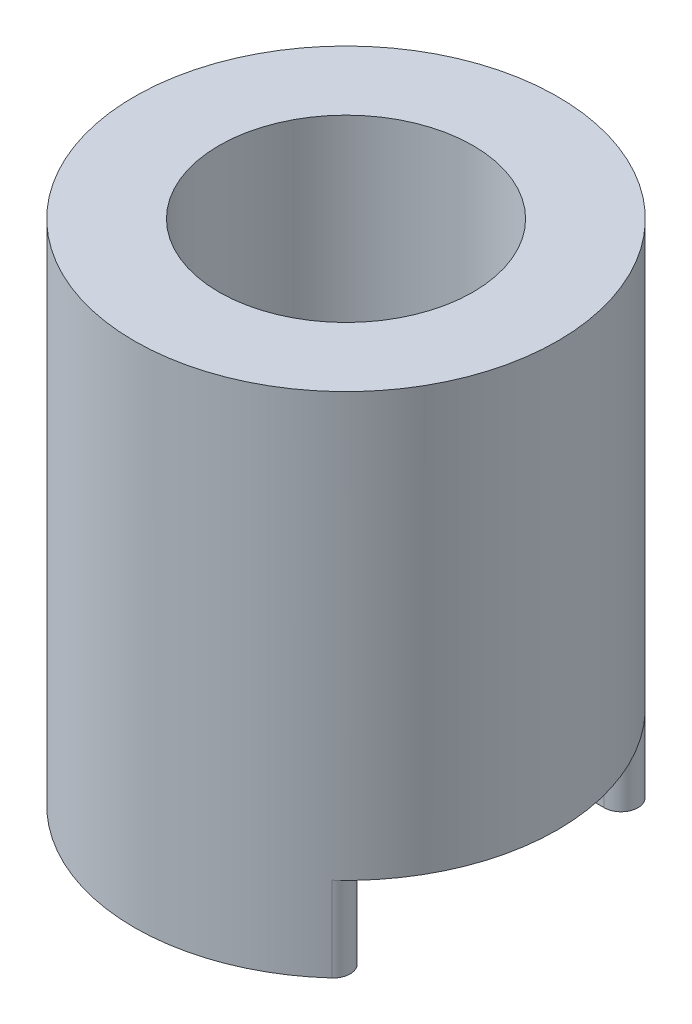
ISO-10303-21;
HEADER;
FILE_DESCRIPTION(('STEP AP214'),'2;1');
FILE_NAME('part.step','',(''),(''),'','','');
FILE_SCHEMA(('AUTOMOTIVE_DESIGN { 1 0 10303 214 1 1 1 1 }'));
ENDSEC;
DATA;
#1=APPLICATION_CONTEXT('core data for automotive mechanical design processes');
#2=APPLICATION_PROTOCOL_DEFINITION('international standard','automotive_design',2000,#1);
#3=PRODUCT_CONTEXT('',#1,'mechanical');
#4=PRODUCT('Part','Part','',(#3));
#5=PRODUCT_RELATED_PRODUCT_CATEGORY('part','',(#4));
#6=PRODUCT_DEFINITION_FORMATION('','',#4);
#7=PRODUCT_DEFINITION_CONTEXT('part definition',#1,'design');
#8=PRODUCT_DEFINITION('design','',#6,#7);
#9=PRODUCT_DEFINITION_SHAPE('','',#8);
#10=(LENGTH_UNIT() NAMED_UNIT(*) SI_UNIT(.MILLI.,.METRE.));
#11=(NAMED_UNIT(*) PLANE_ANGLE_UNIT() SI_UNIT($,.RADIAN.));
#12=(NAMED_UNIT(*) SI_UNIT($,.STERADIAN.) SOLID_ANGLE_UNIT());
#13=UNCERTAINTY_MEASURE_WITH_UNIT(LENGTH_MEASURE(1.E-05),#10,'distance_accuracy_value','');
#14=(GEOMETRIC_REPRESENTATION_CONTEXT(3) GLOBAL_UNCERTAINTY_ASSIGNED_CONTEXT((#13)) GLOBAL_UNIT_ASSIGNED_CONTEXT((#10,
#11,#12)) REPRESENTATION_CONTEXT('',''));
#15=CARTESIAN_POINT('',(0.,0.,0.));
#16=DIRECTION('',(0.,0.,1.));
#17=DIRECTION('',(1.,0.,0.));
#18=AXIS2_PLACEMENT_3D('',#15,#16,#17);
#19=CARTESIAN_POINT('',(-15.875,6.35,-9.525));
#20=DIRECTION('',(0.,1.,0.));
#21=DIRECTION('',(0.,0.,1.));
#22=AXIS2_PLACEMENT_3D('',#19,#20,#21);
#23=PLANE('',#22);
#24=DIRECTION('',(1.,0.,0.));
#25=VECTOR('',#24,1.);
#26=CARTESIAN_POINT('',(-15.875,6.35,9.525));
#27=LINE('',#26,#25);
#28=CARTESIAN_POINT('',(0.,6.35,9.525));
#29=VERTEX_POINT('',#28);
#30=CARTESIAN_POINT('',(9.83737769936684,6.35,9.525));
#31=VERTEX_POINT('',#30);
#32=EDGE_CURVE('E111',#29,#31,#27,.T.);
#33=ORIENTED_EDGE('',*,*,#32,.F.);
#34=CARTESIAN_POINT('',(0.,6.35,0.));
#35=DIRECTION('',(0.,1.,0.));
#36=DIRECTION('',(0.,0.,1.));
#37=AXIS2_PLACEMENT_3D('',#34,#35,#36);
#38=CIRCLE('',#37,9.525);
#39=CARTESIAN_POINT('',(0.,6.35,-9.525));
#40=VERTEX_POINT('',#39);
#41=EDGE_CURVE('E118',#29,#40,#38,.T.);
#42=ORIENTED_EDGE('',*,*,#41,.T.);
#43=DIRECTION('',(1.,0.,0.));
#44=VECTOR('',#43,1.);
#45=CARTESIAN_POINT('',(-15.875,6.35,-9.525));
#46=LINE('',#45,#44);
#47=CARTESIAN_POINT('',(9.83737769936684,6.35,-9.525));
#48=VERTEX_POINT('',#47);
#49=EDGE_CURVE('E112',#40,#48,#46,.T.);
#50=ORIENTED_EDGE('',*,*,#49,.T.);
#51=CARTESIAN_POINT('',(9.83737769936684,6.35,-10.795));
#52=DIRECTION('',(0.,1.,0.));
#53=DIRECTION('',(0.,0.,1.));
#54=AXIS2_PLACEMENT_3D('',#51,#52,#53);
#55=CIRCLE('',#54,1.27);
#56=CARTESIAN_POINT('',(10.6928018471379,6.35,-11.7336956521739));
#57=VERTEX_POINT('',#56);
#58=EDGE_CURVE('E43',#48,#57,#55,.T.);
#59=ORIENTED_EDGE('',*,*,#58,.T.);
#60=CARTESIAN_POINT('',(0.,6.35,0.));
#61=DIRECTION('',(0.,1.,0.));
#62=DIRECTION('',(0.,0.,1.));
#63=AXIS2_PLACEMENT_3D('',#60,#61,#62);
#64=CIRCLE('',#63,15.875);
#65=CARTESIAN_POINT('',(10.6928018471379,6.35,11.7336956521739));
#66=VERTEX_POINT('',#65);
#67=EDGE_CURVE('E142',#66,#57,#64,.T.);
#68=ORIENTED_EDGE('',*,*,#67,.F.);
#69=CARTESIAN_POINT('',(9.83737769936684,6.35,10.795));
#70=DIRECTION('',(0.,1.,0.));
#71=DIRECTION('',(0.,0.,1.));
#72=AXIS2_PLACEMENT_3D('',#69,#70,#71);
#73=CIRCLE('',#72,1.27);
#74=EDGE_CURVE('E172',#66,#31,#73,.T.);
#75=ORIENTED_EDGE('',*,*,#74,.T.);
#76=EDGE_LOOP('',(#33,#42,#50,#59,#68,#75));
#77=FACE_BOUND('',#76,.T.);
#78=ADVANCED_FACE('F35',(#77),#23,.F.);
#79=CARTESIAN_POINT('',(0.,0.,0.));
#80=DIRECTION('',(0.,1.,0.));
#81=DIRECTION('',(0.,0.,1.));
#82=AXIS2_PLACEMENT_3D('',#79,#80,#81);
#83=PLANE('',#82);
#84=DIRECTION('',(1.,0.,0.));
#85=VECTOR('',#84,1.);
#86=CARTESIAN_POINT('',(0.,0.,9.525));
#87=LINE('',#86,#85);
#88=CARTESIAN_POINT('',(-9.83737769936684,0.,9.525));
#89=VERTEX_POINT('',#88);
#90=CARTESIAN_POINT('',(9.83737769936684,0.,9.525));
#91=VERTEX_POINT('',#90);
#92=EDGE_CURVE('E139',#89,#91,#87,.T.);
#93=ORIENTED_EDGE('',*,*,#92,.T.);
#94=CARTESIAN_POINT('',(9.83737769936684,0.,10.795));
#95=DIRECTION('',(0.,1.,0.));
#96=DIRECTION('',(0.,0.,1.));
#97=AXIS2_PLACEMENT_3D('',#94,#95,#96);
#98=CIRCLE('',#97,1.27);
#99=CARTESIAN_POINT('',(10.6928018471379,0.,11.7336956521739));
#100=VERTEX_POINT('',#99);
#101=EDGE_CURVE('E163',#91,#100,#98,.F.);
#102=ORIENTED_EDGE('',*,*,#101,.T.);
#103=CARTESIAN_POINT('',(0.,0.,0.));
#104=DIRECTION('',(0.,1.,0.));
#105=DIRECTION('',(0.,0.,1.));
#106=AXIS2_PLACEMENT_3D('',#103,#104,#105);
#107=CIRCLE('',#106,15.875);
#108=CARTESIAN_POINT('',(-10.6928018471379,0.,11.7336956521739));
#109=VERTEX_POINT('',#108);
#110=EDGE_CURVE('E136',#109,#100,#107,.T.);
#111=ORIENTED_EDGE('',*,*,#110,.F.);
#112=CARTESIAN_POINT('',(-9.83737769936684,0.,10.795));
#113=DIRECTION('',(0.,1.,0.));
#114=DIRECTION('',(0.,0.,1.));
#115=AXIS2_PLACEMENT_3D('',#112,#113,#114);
#116=CIRCLE('',#115,1.27);
#117=EDGE_CURVE('E161',#109,#89,#116,.F.);
#118=ORIENTED_EDGE('',*,*,#117,.T.);
#119=EDGE_LOOP('',(#93,#102,#111,#118));
#120=FACE_BOUND('',#119,.T.);
#121=ADVANCED_FACE('F197',(#120),#83,.F.);
#122=CARTESIAN_POINT('',(0.,38.1,0.));
#123=DIRECTION('',(0.,-1.,0.));
#124=DIRECTION('',(0.,0.,-1.));
#125=AXIS2_PLACEMENT_3D('',#122,#123,#124);
#126=CYLINDRICAL_SURFACE('',#125,15.875);
#127=CARTESIAN_POINT('',(0.,38.1,0.));
#128=DIRECTION('',(0.,1.,0.));
#129=DIRECTION('',(0.,0.,1.));
#130=AXIS2_PLACEMENT_3D('',#127,#128,#129);
#131=CIRCLE('',#130,15.875);
#132=CARTESIAN_POINT('',(0.,38.1,15.875));
#133=VERTEX_POINT('',#132);
#134=EDGE_CURVE('E129',#133,#133,#131,.T.);
#135=ORIENTED_EDGE('',*,*,#134,.F.);
#136=EDGE_LOOP('',(#135));
#137=FACE_BOUND('',#136,.T.);
#138=ORIENTED_EDGE('',*,*,#110,.T.);
#139=DIRECTION('',(0.,-1.,0.));
#140=VECTOR('',#139,1.);
#141=CARTESIAN_POINT('',(10.6928018471379,38.1,11.7336956521739));
#142=LINE('',#141,#140);
#143=EDGE_CURVE('E154',#100,#66,#142,.F.);
#144=ORIENTED_EDGE('',*,*,#143,.T.);
#145=ORIENTED_EDGE('',*,*,#67,.T.);
#146=DIRECTION('',(0.,-1.,0.));
#147=VECTOR('',#146,1.);
#148=CARTESIAN_POINT('',(10.6928018471379,38.1,-11.7336956521739));
#149=LINE('',#148,#147);
#150=CARTESIAN_POINT('',(10.6928018471379,0.,-11.7336956521739));
#151=VERTEX_POINT('',#150);
#152=EDGE_CURVE('E148',#57,#151,#149,.T.);
#153=ORIENTED_EDGE('',*,*,#152,.T.);
#154=CARTESIAN_POINT('',(-10.6928018471379,0.,-11.7336956521739));
#155=VERTEX_POINT('',#154);
#156=EDGE_CURVE('E133',#151,#155,#107,.T.);
#157=ORIENTED_EDGE('',*,*,#156,.T.);
#158=DIRECTION('',(0.,-1.,0.));
#159=VECTOR('',#158,1.);
#160=CARTESIAN_POINT('',(-10.6928018471379,38.1,-11.7336956521739));
#161=LINE('',#160,#159);
#162=CARTESIAN_POINT('',(-10.6928018471379,6.35,-11.7336956521739));
#163=VERTEX_POINT('',#162);
#164=EDGE_CURVE('E145',#155,#163,#161,.F.);
#165=ORIENTED_EDGE('',*,*,#164,.T.);
#166=CARTESIAN_POINT('',(-10.6928018471379,6.35,11.7336956521739));
#167=VERTEX_POINT('',#166);
#168=EDGE_CURVE('E144',#163,#167,#64,.T.);
#169=ORIENTED_EDGE('',*,*,#168,.T.);
#170=DIRECTION('',(0.,-1.,0.));
#171=VECTOR('',#170,1.);
#172=CARTESIAN_POINT('',(-10.6928018471379,38.1,11.7336956521739));
#173=LINE('',#172,#171);
#174=EDGE_CURVE('E151',#167,#109,#173,.T.);
#175=ORIENTED_EDGE('',*,*,#174,.T.);
#176=EDGE_LOOP('',(#138,#144,#145,#153,#157,#165,#169,#175));
#177=FACE_BOUND('',#176,.T.);
#178=ADVANCED_FACE('F183',(#137,#177),#126,.T.);
#179=CARTESIAN_POINT('',(0.,38.1,0.));
#180=DIRECTION('',(0.,1.,0.));
#181=DIRECTION('',(0.,0.,1.));
#182=AXIS2_PLACEMENT_3D('',#179,#180,#181);
#183=PLANE('',#182);
#184=CARTESIAN_POINT('',(0.,38.1,0.));
#185=DIRECTION('',(0.,1.,0.));
#186=DIRECTION('',(0.,0.,1.));
#187=AXIS2_PLACEMENT_3D('',#184,#185,#186);
#188=CIRCLE('',#187,9.525);
#189=CARTESIAN_POINT('',(0.,38.1,9.525));
#190=VERTEX_POINT('',#189);
#191=EDGE_CURVE('E119',#190,#190,#188,.T.);
#192=ORIENTED_EDGE('',*,*,#191,.F.);
#193=EDGE_LOOP('',(#192));
#194=FACE_BOUND('',#193,.T.);
#195=ORIENTED_EDGE('',*,*,#134,.T.);
#196=EDGE_LOOP('',(#195));
#197=FACE_BOUND('',#196,.T.);
#198=ADVANCED_FACE('F229',(#194,#197),#183,.T.);
#199=ORIENTED_EDGE('',*,*,#156,.F.);
#200=CARTESIAN_POINT('',(9.83737769936684,0.,-10.795));
#201=DIRECTION('',(0.,1.,0.));
#202=DIRECTION('',(0.,0.,1.));
#203=AXIS2_PLACEMENT_3D('',#200,#201,#202);
#204=CIRCLE('',#203,1.27);
#205=CARTESIAN_POINT('',(9.83737769936684,0.,-9.525));
#206=VERTEX_POINT('',#205);
#207=EDGE_CURVE('E167',#151,#206,#204,.F.);
#208=ORIENTED_EDGE('',*,*,#207,.T.);
#209=DIRECTION('',(-1.,0.,0.));
#210=VECTOR('',#209,1.);
#211=CARTESIAN_POINT('',(0.,0.,-9.525));
#212=LINE('',#211,#210);
#213=CARTESIAN_POINT('',(-9.83737769936684,0.,-9.525));
#214=VERTEX_POINT('',#213);
#215=EDGE_CURVE('E132',#206,#214,#212,.T.);
#216=ORIENTED_EDGE('',*,*,#215,.T.);
#217=CARTESIAN_POINT('',(-9.83737769936684,0.,-10.795));
#218=DIRECTION('',(0.,1.,0.));
#219=DIRECTION('',(0.,0.,1.));
#220=AXIS2_PLACEMENT_3D('',#217,#218,#219);
#221=CIRCLE('',#220,1.27);
#222=EDGE_CURVE('E165',#214,#155,#221,.F.);
#223=ORIENTED_EDGE('',*,*,#222,.T.);
#224=EDGE_LOOP('',(#199,#208,#216,#223));
#225=FACE_BOUND('',#224,.T.);
#226=ADVANCED_FACE('F186',(#225),#83,.F.);
#227=ORIENTED_EDGE('',*,*,#168,.F.);
#228=CARTESIAN_POINT('',(-9.83737769936684,6.35,-10.795));
#229=DIRECTION('',(0.,1.,0.));
#230=DIRECTION('',(0.,0.,1.));
#231=AXIS2_PLACEMENT_3D('',#228,#229,#230);
#232=CIRCLE('',#231,1.27);
#233=CARTESIAN_POINT('',(-9.83737769936684,6.35,-9.525));
#234=VERTEX_POINT('',#233);
#235=EDGE_CURVE('E11',#163,#234,#232,.T.);
#236=ORIENTED_EDGE('',*,*,#235,.T.);
#237=EDGE_CURVE('E104',#234,#40,#46,.T.);
#238=ORIENTED_EDGE('',*,*,#237,.T.);
#239=EDGE_CURVE('E108',#40,#29,#38,.T.);
#240=ORIENTED_EDGE('',*,*,#239,.T.);
#241=CARTESIAN_POINT('',(-9.83737769936684,6.35,9.525));
#242=VERTEX_POINT('',#241);
#243=EDGE_CURVE('E128',#242,#29,#27,.T.);
#244=ORIENTED_EDGE('',*,*,#243,.F.);
#245=CARTESIAN_POINT('',(-9.83737769936684,6.35,10.795));
#246=DIRECTION('',(0.,1.,0.));
#247=DIRECTION('',(0.,0.,1.));
#248=AXIS2_PLACEMENT_3D('',#245,#246,#247);
#249=CIRCLE('',#248,1.27);
#250=EDGE_CURVE('E174',#242,#167,#249,.T.);
#251=ORIENTED_EDGE('',*,*,#250,.T.);
#252=EDGE_LOOP('',(#227,#236,#238,#240,#244,#251));
#253=FACE_BOUND('',#252,.T.);
#254=ADVANCED_FACE('F106',(#253),#23,.F.);
#255=CARTESIAN_POINT('',(-15.875,0.,9.525));
#256=DIRECTION('',(0.,0.,1.));
#257=DIRECTION('',(0.,-1.,0.));
#258=AXIS2_PLACEMENT_3D('',#255,#256,#257);
#259=PLANE('',#258);
#260=ORIENTED_EDGE('',*,*,#32,.T.);
#261=DIRECTION('',(0.,-1.,0.));
#262=VECTOR('',#261,1.);
#263=CARTESIAN_POINT('',(9.83737769936684,0.,9.525));
#264=LINE('',#263,#262);
#265=EDGE_CURVE('E159',#31,#91,#264,.T.);
#266=ORIENTED_EDGE('',*,*,#265,.T.);
#267=ORIENTED_EDGE('',*,*,#92,.F.);
#268=DIRECTION('',(0.,-1.,0.));
#269=VECTOR('',#268,1.);
#270=CARTESIAN_POINT('',(-9.83737769936684,0.,9.525));
#271=LINE('',#270,#269);
#272=EDGE_CURVE('E157',#89,#242,#271,.F.);
#273=ORIENTED_EDGE('',*,*,#272,.T.);
#274=ORIENTED_EDGE('',*,*,#243,.T.);
#275=EDGE_LOOP('',(#260,#266,#267,#273,#274));
#276=FACE_BOUND('',#275,.T.);
#277=ADVANCED_FACE('F200',(#276),#259,.F.);
#278=CARTESIAN_POINT('',(-15.875,0.,-9.525));
#279=DIRECTION('',(0.,0.,-1.));
#280=DIRECTION('',(0.,1.,0.));
#281=AXIS2_PLACEMENT_3D('',#278,#279,#280);
#282=PLANE('',#281);
#283=ORIENTED_EDGE('',*,*,#215,.F.);
#284=DIRECTION('',(0.,-1.,0.));
#285=VECTOR('',#284,1.);
#286=CARTESIAN_POINT('',(9.83737769936684,0.,-9.525));
#287=LINE('',#286,#285);
#288=EDGE_CURVE('E56',#206,#48,#287,.F.);
#289=ORIENTED_EDGE('',*,*,#288,.T.);
#290=ORIENTED_EDGE('',*,*,#49,.F.);
#291=ORIENTED_EDGE('',*,*,#237,.F.);
#292=DIRECTION('',(0.,-1.,0.));
#293=VECTOR('',#292,1.);
#294=CARTESIAN_POINT('',(-9.83737769936684,0.,-9.525));
#295=LINE('',#294,#293);
#296=EDGE_CURVE('E169',#234,#214,#295,.T.);
#297=ORIENTED_EDGE('',*,*,#296,.T.);
#298=EDGE_LOOP('',(#283,#289,#290,#291,#297));
#299=FACE_BOUND('',#298,.T.);
#300=ADVANCED_FACE('F125',(#299),#282,.F.);
#301=CARTESIAN_POINT('',(0.,0.,0.));
#302=DIRECTION('',(0.,1.,0.));
#303=DIRECTION('',(0.,0.,1.));
#304=AXIS2_PLACEMENT_3D('',#301,#302,#303);
#305=CYLINDRICAL_SURFACE('',#304,9.525);
#306=ORIENTED_EDGE('',*,*,#191,.T.);
#307=EDGE_LOOP('',(#306));
#308=FACE_BOUND('',#307,.T.);
#309=ORIENTED_EDGE('',*,*,#239,.F.);
#310=ORIENTED_EDGE('',*,*,#41,.F.);
#311=EDGE_LOOP('',(#309,#310));
#312=FACE_BOUND('',#311,.T.);
#313=ADVANCED_FACE('F117',(#308,#312),#305,.F.);
#314=CARTESIAN_POINT('',(9.83737769936684,38.1,10.795));
#315=DIRECTION('',(0.,-1.,0.));
#316=DIRECTION('',(0.,0.,-1.));
#317=AXIS2_PLACEMENT_3D('',#314,#315,#316);
#318=CYLINDRICAL_SURFACE('',#317,1.27);
#319=ORIENTED_EDGE('',*,*,#101,.F.);
#320=ORIENTED_EDGE('',*,*,#265,.F.);
#321=ORIENTED_EDGE('',*,*,#74,.F.);
#322=ORIENTED_EDGE('',*,*,#143,.F.);
#323=EDGE_LOOP('',(#319,#320,#321,#322));
#324=FACE_BOUND('',#323,.T.);
#325=ADVANCED_FACE('F203',(#324),#318,.T.);
#326=CARTESIAN_POINT('',(-9.83737769936684,38.1,10.795));
#327=DIRECTION('',(0.,-1.,0.));
#328=DIRECTION('',(0.,0.,-1.));
#329=AXIS2_PLACEMENT_3D('',#326,#327,#328);
#330=CYLINDRICAL_SURFACE('',#329,1.27);
#331=ORIENTED_EDGE('',*,*,#250,.F.);
#332=ORIENTED_EDGE('',*,*,#272,.F.);
#333=ORIENTED_EDGE('',*,*,#117,.F.);
#334=ORIENTED_EDGE('',*,*,#174,.F.);
#335=EDGE_LOOP('',(#331,#332,#333,#334));
#336=FACE_BOUND('',#335,.T.);
#337=ADVANCED_FACE('F194',(#336),#330,.T.);
#338=CARTESIAN_POINT('',(9.83737769936684,38.1,-10.795));
#339=DIRECTION('',(0.,-1.,0.));
#340=DIRECTION('',(0.,0.,-1.));
#341=AXIS2_PLACEMENT_3D('',#338,#339,#340);
#342=CYLINDRICAL_SURFACE('',#341,1.27);
#343=ORIENTED_EDGE('',*,*,#58,.F.);
#344=ORIENTED_EDGE('',*,*,#288,.F.);
#345=ORIENTED_EDGE('',*,*,#207,.F.);
#346=ORIENTED_EDGE('',*,*,#152,.F.);
#347=EDGE_LOOP('',(#343,#344,#345,#346));
#348=FACE_BOUND('',#347,.T.);
#349=ADVANCED_FACE('F179',(#348),#342,.T.);
#350=CARTESIAN_POINT('',(-9.83737769936684,38.1,-10.795));
#351=DIRECTION('',(0.,-1.,0.));
#352=DIRECTION('',(0.,0.,-1.));
#353=AXIS2_PLACEMENT_3D('',#350,#351,#352);
#354=CYLINDRICAL_SURFACE('',#353,1.27);
#355=ORIENTED_EDGE('',*,*,#222,.F.);
#356=ORIENTED_EDGE('',*,*,#296,.F.);
#357=ORIENTED_EDGE('',*,*,#235,.F.);
#358=ORIENTED_EDGE('',*,*,#164,.F.);
#359=EDGE_LOOP('',(#355,#356,#357,#358));
#360=FACE_BOUND('',#359,.T.);
#361=ADVANCED_FACE('F37',(#360),#354,.T.);
#362=CLOSED_SHELL('',(#78,#121,#178,#198,#226,#254,#277,#300,#313,#325,#337,#349,#361));
#363=MANIFOLD_SOLID_BREP('B2',#362);
#364=ADVANCED_BREP_SHAPE_REPRESENTATION('',(#18,#363),#14);
#365=SHAPE_DEFINITION_REPRESENTATION(#9,#364);
ENDSEC;
END-ISO-10303-21;
